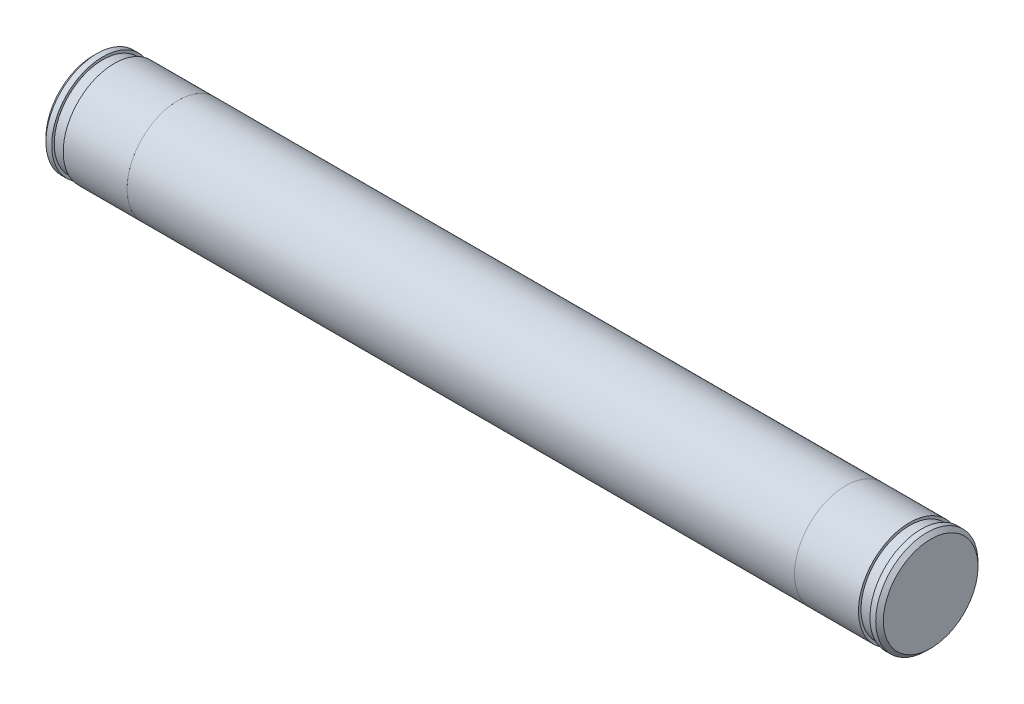
ISO-10303-21;
HEADER;
FILE_DESCRIPTION(('STEP AP214'),'2;1');
FILE_NAME('part.step','',(''),(''),'','','');
FILE_SCHEMA(('AUTOMOTIVE_DESIGN { 1 0 10303 214 1 1 1 1 }'));
ENDSEC;
DATA;
#1=APPLICATION_CONTEXT('core data for automotive mechanical design processes');
#2=APPLICATION_PROTOCOL_DEFINITION('international standard','automotive_design',2000,#1);
#3=PRODUCT_CONTEXT('',#1,'mechanical');
#4=PRODUCT('Part','Part','',(#3));
#5=PRODUCT_RELATED_PRODUCT_CATEGORY('part','',(#4));
#6=PRODUCT_DEFINITION_FORMATION('','',#4);
#7=PRODUCT_DEFINITION_CONTEXT('part definition',#1,'design');
#8=PRODUCT_DEFINITION('design','',#6,#7);
#9=PRODUCT_DEFINITION_SHAPE('','',#8);
#10=(LENGTH_UNIT() NAMED_UNIT(*) SI_UNIT(.MILLI.,.METRE.));
#11=(NAMED_UNIT(*) PLANE_ANGLE_UNIT() SI_UNIT($,.RADIAN.));
#12=(NAMED_UNIT(*) SI_UNIT($,.STERADIAN.) SOLID_ANGLE_UNIT());
#13=UNCERTAINTY_MEASURE_WITH_UNIT(LENGTH_MEASURE(1.E-05),#10,'distance_accuracy_value','');
#14=(GEOMETRIC_REPRESENTATION_CONTEXT(3) GLOBAL_UNCERTAINTY_ASSIGNED_CONTEXT((#13)) GLOBAL_UNIT_ASSIGNED_CONTEXT((#10,
#11,#12)) REPRESENTATION_CONTEXT('',''));
#15=CARTESIAN_POINT('',(0.,0.,0.));
#16=DIRECTION('',(0.,0.,1.));
#17=DIRECTION('',(1.,0.,0.));
#18=AXIS2_PLACEMENT_3D('',#15,#16,#17);
#19=CARTESIAN_POINT('',(32.75,0.,0.));
#20=DIRECTION('',(1.,0.,0.));
#21=DIRECTION('',(0.,0.,-1.));
#22=AXIS2_PLACEMENT_3D('',#19,#20,#21);
#23=PLANE('',#22);
#24=CARTESIAN_POINT('',(32.7499999999645,0.,0.));
#25=DIRECTION('',(-1.,0.,0.));
#26=DIRECTION('',(0.,0.,1.));
#27=AXIS2_PLACEMENT_3D('',#24,#25,#26);
#28=CIRCLE('',#27,3.70000000003756);
#29=CARTESIAN_POINT('',(32.7499999999645,0.,3.70000000003756));
#30=VERTEX_POINT('',#29);
#31=EDGE_CURVE('E18',#30,#30,#28,.T.);
#32=ORIENTED_EDGE('',*,*,#31,.F.);
#33=EDGE_LOOP('',(#32));
#34=FACE_BOUND('',#33,.T.);
#35=ADVANCED_FACE('F15',(#34),#23,.T.);
#36=CARTESIAN_POINT('',(-32.75,0.,0.));
#37=DIRECTION('',(-1.,0.,0.));
#38=DIRECTION('',(0.,0.,1.));
#39=AXIS2_PLACEMENT_3D('',#36,#37,#38);
#40=PLANE('',#39);
#41=CARTESIAN_POINT('',(-32.7499999999645,0.,0.));
#42=DIRECTION('',(1.,0.,0.));
#43=DIRECTION('',(0.,0.,-1.));
#44=AXIS2_PLACEMENT_3D('',#41,#42,#43);
#45=CIRCLE('',#44,3.70000000003756);
#46=CARTESIAN_POINT('',(-32.7499999999645,0.,-3.70000000003756));
#47=VERTEX_POINT('',#46);
#48=EDGE_CURVE('E62',#47,#47,#45,.T.);
#49=ORIENTED_EDGE('',*,*,#48,.F.);
#50=EDGE_LOOP('',(#49));
#51=FACE_BOUND('',#50,.T.);
#52=ADVANCED_FACE('F75',(#51),#40,.T.);
#53=CARTESIAN_POINT('',(32.449999999983,0.,0.));
#54=DIRECTION('',(-1.,0.,0.));
#55=DIRECTION('',(0.,0.,1.));
#56=AXIS2_PLACEMENT_3D('',#53,#54,#55);
#57=CONICAL_SURFACE('',#56,4.0000000000191,0.785398163397448);
#58=ORIENTED_EDGE('',*,*,#31,.T.);
#59=EDGE_LOOP('',(#58));
#60=FACE_BOUND('',#59,.T.);
#61=CARTESIAN_POINT('',(32.45,0.,0.));
#62=DIRECTION('',(1.,0.,0.));
#63=DIRECTION('',(0.,0.,-1.));
#64=AXIS2_PLACEMENT_3D('',#61,#62,#63);
#65=CIRCLE('',#64,4.);
#66=CARTESIAN_POINT('',(32.45,0.,-4.));
#67=VERTEX_POINT('',#66);
#68=EDGE_CURVE('E64',#67,#67,#65,.F.);
#69=ORIENTED_EDGE('',*,*,#68,.F.);
#70=EDGE_LOOP('',(#69));
#71=FACE_BOUND('',#70,.T.);
#72=ADVANCED_FACE('F71',(#60,#71),#57,.T.);
#73=CARTESIAN_POINT('',(-32.449999999983,0.,0.));
#74=DIRECTION('',(1.,0.,0.));
#75=DIRECTION('',(0.,0.,-1.));
#76=AXIS2_PLACEMENT_3D('',#73,#74,#75);
#77=CONICAL_SURFACE('',#76,4.0000000000191,0.785398163397448);
#78=ORIENTED_EDGE('',*,*,#48,.T.);
#79=EDGE_LOOP('',(#78));
#80=FACE_BOUND('',#79,.T.);
#81=CARTESIAN_POINT('',(-32.45,0.,0.));
#82=DIRECTION('',(1.,0.,0.));
#83=DIRECTION('',(0.,0.,-1.));
#84=AXIS2_PLACEMENT_3D('',#81,#82,#83);
#85=CIRCLE('',#84,4.);
#86=CARTESIAN_POINT('',(-32.45,0.,-4.));
#87=VERTEX_POINT('',#86);
#88=EDGE_CURVE('E61',#87,#87,#85,.T.);
#89=ORIENTED_EDGE('',*,*,#88,.F.);
#90=EDGE_LOOP('',(#89));
#91=FACE_BOUND('',#90,.T.);
#92=ADVANCED_FACE('F135',(#80,#91),#77,.T.);
#93=CARTESIAN_POINT('',(32.75,0.,0.));
#94=DIRECTION('',(1.,0.,0.));
#95=DIRECTION('',(0.,0.,-1.));
#96=AXIS2_PLACEMENT_3D('',#93,#94,#95);
#97=CYLINDRICAL_SURFACE('',#96,4.);
#98=CARTESIAN_POINT('',(32.,0.,0.));
#99=DIRECTION('',(1.,0.,0.));
#100=DIRECTION('',(0.,0.,-1.));
#101=AXIS2_PLACEMENT_3D('',#98,#99,#100);
#102=CIRCLE('',#101,4.);
#103=CARTESIAN_POINT('',(32.,0.,-4.));
#104=VERTEX_POINT('',#103);
#105=EDGE_CURVE('E59',#104,#104,#102,.F.);
#106=ORIENTED_EDGE('',*,*,#105,.F.);
#107=EDGE_LOOP('',(#106));
#108=FACE_BOUND('',#107,.T.);
#109=ORIENTED_EDGE('',*,*,#68,.T.);
#110=EDGE_LOOP('',(#109));
#111=FACE_BOUND('',#110,.T.);
#112=ADVANCED_FACE('F131',(#108,#111),#97,.T.);
#113=CARTESIAN_POINT('',(32.75,0.,0.));
#114=DIRECTION('',(1.,0.,0.));
#115=DIRECTION('',(0.,0.,-1.));
#116=AXIS2_PLACEMENT_3D('',#113,#114,#115);
#117=CYLINDRICAL_SURFACE('',#116,4.);
#118=ORIENTED_EDGE('',*,*,#88,.T.);
#119=EDGE_LOOP('',(#118));
#120=FACE_BOUND('',#119,.T.);
#121=CARTESIAN_POINT('',(-32.,0.,0.));
#122=DIRECTION('',(1.,0.,0.));
#123=DIRECTION('',(0.,0.,-1.));
#124=AXIS2_PLACEMENT_3D('',#121,#122,#123);
#125=CIRCLE('',#124,4.);
#126=CARTESIAN_POINT('',(-32.,0.,-4.));
#127=VERTEX_POINT('',#126);
#128=EDGE_CURVE('E56',#127,#127,#125,.T.);
#129=ORIENTED_EDGE('',*,*,#128,.F.);
#130=EDGE_LOOP('',(#129));
#131=FACE_BOUND('',#130,.T.);
#132=ADVANCED_FACE('F127',(#120,#131),#117,.T.);
#133=CARTESIAN_POINT('',(32.,3.99999999999999,0.));
#134=DIRECTION('',(-1.,0.,0.));
#135=DIRECTION('',(0.,0.,1.));
#136=AXIS2_PLACEMENT_3D('',#133,#134,#135);
#137=PLANE('',#136);
#138=CARTESIAN_POINT('',(32.,0.,0.));
#139=DIRECTION('',(1.,0.,0.));
#140=DIRECTION('',(0.,0.,-1.));
#141=AXIS2_PLACEMENT_3D('',#138,#139,#140);
#142=CIRCLE('',#141,3.80000000000001);
#143=CARTESIAN_POINT('',(32.,0.,-3.80000000000001));
#144=VERTEX_POINT('',#143);
#145=EDGE_CURVE('E53',#144,#144,#142,.F.);
#146=ORIENTED_EDGE('',*,*,#145,.F.);
#147=EDGE_LOOP('',(#146));
#148=FACE_BOUND('',#147,.T.);
#149=ORIENTED_EDGE('',*,*,#105,.T.);
#150=EDGE_LOOP('',(#149));
#151=FACE_BOUND('',#150,.T.);
#152=ADVANCED_FACE('F123',(#148,#151),#137,.T.);
#153=CARTESIAN_POINT('',(-32.,3.99999999999999,0.));
#154=DIRECTION('',(1.,0.,0.));
#155=DIRECTION('',(0.,0.,-1.));
#156=AXIS2_PLACEMENT_3D('',#153,#154,#155);
#157=PLANE('',#156);
#158=CARTESIAN_POINT('',(-32.,0.,0.));
#159=DIRECTION('',(1.,0.,0.));
#160=DIRECTION('',(0.,0.,-1.));
#161=AXIS2_PLACEMENT_3D('',#158,#159,#160);
#162=CIRCLE('',#161,3.80000000000001);
#163=CARTESIAN_POINT('',(-32.,0.,-3.80000000000001));
#164=VERTEX_POINT('',#163);
#165=EDGE_CURVE('E50',#164,#164,#162,.T.);
#166=ORIENTED_EDGE('',*,*,#165,.F.);
#167=EDGE_LOOP('',(#166));
#168=FACE_BOUND('',#167,.T.);
#169=ORIENTED_EDGE('',*,*,#128,.T.);
#170=EDGE_LOOP('',(#169));
#171=FACE_BOUND('',#170,.T.);
#172=ADVANCED_FACE('F119',(#168,#171),#157,.T.);
#173=CARTESIAN_POINT('',(32.75,0.,0.));
#174=DIRECTION('',(1.,0.,0.));
#175=DIRECTION('',(0.,0.,-1.));
#176=AXIS2_PLACEMENT_3D('',#173,#174,#175);
#177=CYLINDRICAL_SURFACE('',#176,3.80000000000001);
#178=CARTESIAN_POINT('',(31.1,0.,0.));
#179=DIRECTION('',(1.,0.,0.));
#180=DIRECTION('',(0.,0.,-1.));
#181=AXIS2_PLACEMENT_3D('',#178,#179,#180);
#182=CIRCLE('',#181,3.80000000000001);
#183=CARTESIAN_POINT('',(31.1,0.,-3.80000000000001));
#184=VERTEX_POINT('',#183);
#185=EDGE_CURVE('E47',#184,#184,#182,.F.);
#186=ORIENTED_EDGE('',*,*,#185,.F.);
#187=EDGE_LOOP('',(#186));
#188=FACE_BOUND('',#187,.T.);
#189=ORIENTED_EDGE('',*,*,#145,.T.);
#190=EDGE_LOOP('',(#189));
#191=FACE_BOUND('',#190,.T.);
#192=ADVANCED_FACE('F115',(#188,#191),#177,.T.);
#193=CARTESIAN_POINT('',(32.75,0.,0.));
#194=DIRECTION('',(1.,0.,0.));
#195=DIRECTION('',(0.,0.,-1.));
#196=AXIS2_PLACEMENT_3D('',#193,#194,#195);
#197=CYLINDRICAL_SURFACE('',#196,3.80000000000001);
#198=ORIENTED_EDGE('',*,*,#165,.T.);
#199=EDGE_LOOP('',(#198));
#200=FACE_BOUND('',#199,.T.);
#201=CARTESIAN_POINT('',(-31.1,0.,0.));
#202=DIRECTION('',(1.,0.,0.));
#203=DIRECTION('',(0.,0.,-1.));
#204=AXIS2_PLACEMENT_3D('',#201,#202,#203);
#205=CIRCLE('',#204,3.80000000000001);
#206=CARTESIAN_POINT('',(-31.1,0.,-3.80000000000001));
#207=VERTEX_POINT('',#206);
#208=EDGE_CURVE('E44',#207,#207,#205,.T.);
#209=ORIENTED_EDGE('',*,*,#208,.F.);
#210=EDGE_LOOP('',(#209));
#211=FACE_BOUND('',#210,.T.);
#212=ADVANCED_FACE('F111',(#200,#211),#197,.T.);
#213=CARTESIAN_POINT('',(31.1,3.8,0.));
#214=DIRECTION('',(1.,0.,0.));
#215=DIRECTION('',(0.,0.,-1.));
#216=AXIS2_PLACEMENT_3D('',#213,#214,#215);
#217=PLANE('',#216);
#218=ORIENTED_EDGE('',*,*,#185,.T.);
#219=EDGE_LOOP('',(#218));
#220=FACE_BOUND('',#219,.T.);
#221=CARTESIAN_POINT('',(31.1,0.,0.));
#222=DIRECTION('',(1.,0.,0.));
#223=DIRECTION('',(0.,0.,-1.));
#224=AXIS2_PLACEMENT_3D('',#221,#222,#223);
#225=CIRCLE('',#224,4.);
#226=CARTESIAN_POINT('',(31.1,0.,-4.));
#227=VERTEX_POINT('',#226);
#228=EDGE_CURVE('E41',#227,#227,#225,.F.);
#229=ORIENTED_EDGE('',*,*,#228,.F.);
#230=EDGE_LOOP('',(#229));
#231=FACE_BOUND('',#230,.T.);
#232=ADVANCED_FACE('F107',(#220,#231),#217,.T.);
#233=CARTESIAN_POINT('',(-31.1,3.8,0.));
#234=DIRECTION('',(-1.,0.,0.));
#235=DIRECTION('',(0.,0.,1.));
#236=AXIS2_PLACEMENT_3D('',#233,#234,#235);
#237=PLANE('',#236);
#238=ORIENTED_EDGE('',*,*,#208,.T.);
#239=EDGE_LOOP('',(#238));
#240=FACE_BOUND('',#239,.T.);
#241=CARTESIAN_POINT('',(-31.1,0.,0.));
#242=DIRECTION('',(1.,0.,0.));
#243=DIRECTION('',(0.,0.,-1.));
#244=AXIS2_PLACEMENT_3D('',#241,#242,#243);
#245=CIRCLE('',#244,4.);
#246=CARTESIAN_POINT('',(-31.1,0.,-4.));
#247=VERTEX_POINT('',#246);
#248=EDGE_CURVE('E38',#247,#247,#245,.T.);
#249=ORIENTED_EDGE('',*,*,#248,.F.);
#250=EDGE_LOOP('',(#249));
#251=FACE_BOUND('',#250,.T.);
#252=ADVANCED_FACE('F103',(#240,#251),#237,.T.);
#253=CARTESIAN_POINT('',(32.75,0.,0.));
#254=DIRECTION('',(1.,0.,0.));
#255=DIRECTION('',(0.,0.,-1.));
#256=AXIS2_PLACEMENT_3D('',#253,#254,#255);
#257=CYLINDRICAL_SURFACE('',#256,4.);
#258=CARTESIAN_POINT('',(26.1,0.,0.));
#259=DIRECTION('',(1.,0.,0.));
#260=DIRECTION('',(0.,0.,-1.));
#261=AXIS2_PLACEMENT_3D('',#258,#259,#260);
#262=CIRCLE('',#261,4.);
#263=CARTESIAN_POINT('',(26.1,0.,-4.));
#264=VERTEX_POINT('',#263);
#265=EDGE_CURVE('E35',#264,#264,#262,.F.);
#266=ORIENTED_EDGE('',*,*,#265,.F.);
#267=EDGE_LOOP('',(#266));
#268=FACE_BOUND('',#267,.T.);
#269=ORIENTED_EDGE('',*,*,#228,.T.);
#270=EDGE_LOOP('',(#269));
#271=FACE_BOUND('',#270,.T.);
#272=ADVANCED_FACE('F99',(#268,#271),#257,.T.);
#273=CARTESIAN_POINT('',(32.75,0.,0.));
#274=DIRECTION('',(1.,0.,0.));
#275=DIRECTION('',(0.,0.,-1.));
#276=AXIS2_PLACEMENT_3D('',#273,#274,#275);
#277=CYLINDRICAL_SURFACE('',#276,4.);
#278=ORIENTED_EDGE('',*,*,#248,.T.);
#279=EDGE_LOOP('',(#278));
#280=FACE_BOUND('',#279,.T.);
#281=CARTESIAN_POINT('',(-26.1,0.,0.));
#282=DIRECTION('',(1.,0.,0.));
#283=DIRECTION('',(0.,0.,-1.));
#284=AXIS2_PLACEMENT_3D('',#281,#282,#283);
#285=CIRCLE('',#284,4.);
#286=CARTESIAN_POINT('',(-26.1,0.,-4.));
#287=VERTEX_POINT('',#286);
#288=EDGE_CURVE('E27',#287,#287,#285,.T.);
#289=ORIENTED_EDGE('',*,*,#288,.F.);
#290=EDGE_LOOP('',(#289));
#291=FACE_BOUND('',#290,.T.);
#292=ADVANCED_FACE('F95',(#280,#291),#277,.T.);
#293=CARTESIAN_POINT('',(26.1,3.99900000000064,0.));
#294=DIRECTION('',(-1.,0.,0.));
#295=DIRECTION('',(0.,0.,1.));
#296=AXIS2_PLACEMENT_3D('',#293,#294,#295);
#297=PLANE('',#296);
#298=CARTESIAN_POINT('',(26.1,0.,0.));
#299=DIRECTION('',(1.,0.,0.));
#300=DIRECTION('',(0.,0.,-1.));
#301=AXIS2_PLACEMENT_3D('',#298,#299,#300);
#302=CIRCLE('',#301,3.99900000000065);
#303=CARTESIAN_POINT('',(26.1,0.,-3.99900000000065));
#304=VERTEX_POINT('',#303);
#305=EDGE_CURVE('E22',#304,#304,#302,.F.);
#306=ORIENTED_EDGE('',*,*,#305,.F.);
#307=EDGE_LOOP('',(#306));
#308=FACE_BOUND('',#307,.T.);
#309=ORIENTED_EDGE('',*,*,#265,.T.);
#310=EDGE_LOOP('',(#309));
#311=FACE_BOUND('',#310,.T.);
#312=ADVANCED_FACE('F88',(#308,#311),#297,.T.);
#313=CARTESIAN_POINT('',(-26.1,3.99999999999999,0.));
#314=DIRECTION('',(1.,0.,0.));
#315=DIRECTION('',(0.,0.,-1.));
#316=AXIS2_PLACEMENT_3D('',#313,#314,#315);
#317=PLANE('',#316);
#318=CARTESIAN_POINT('',(-26.1,0.,0.));
#319=DIRECTION('',(1.,0.,0.));
#320=DIRECTION('',(0.,0.,-1.));
#321=AXIS2_PLACEMENT_3D('',#318,#319,#320);
#322=CIRCLE('',#321,3.99900000000065);
#323=CARTESIAN_POINT('',(-26.1,0.,-3.99900000000065));
#324=VERTEX_POINT('',#323);
#325=EDGE_CURVE('E10',#324,#324,#322,.T.);
#326=ORIENTED_EDGE('',*,*,#325,.F.);
#327=EDGE_LOOP('',(#326));
#328=FACE_BOUND('',#327,.T.);
#329=ORIENTED_EDGE('',*,*,#288,.T.);
#330=EDGE_LOOP('',(#329));
#331=FACE_BOUND('',#330,.T.);
#332=ADVANCED_FACE('F83',(#328,#331),#317,.T.);
#333=CARTESIAN_POINT('',(32.75,0.,0.));
#334=DIRECTION('',(1.,0.,0.));
#335=DIRECTION('',(0.,0.,-1.));
#336=AXIS2_PLACEMENT_3D('',#333,#334,#335);
#337=CYLINDRICAL_SURFACE('',#336,3.99900000000065);
#338=ORIENTED_EDGE('',*,*,#325,.T.);
#339=EDGE_LOOP('',(#338));
#340=FACE_BOUND('',#339,.T.);
#341=ORIENTED_EDGE('',*,*,#305,.T.);
#342=EDGE_LOOP('',(#341));
#343=FACE_BOUND('',#342,.T.);
#344=ADVANCED_FACE('F81',(#340,#343),#337,.T.);
#345=CLOSED_SHELL('',(#35,#52,#72,#92,#112,#132,#152,#172,#192,#212,#232,#252,#272,#292,#312,
#332,#344));
#346=MANIFOLD_SOLID_BREP('B1',#345);
#347=ADVANCED_BREP_SHAPE_REPRESENTATION('',(#18,#346),#14);
#348=SHAPE_DEFINITION_REPRESENTATION(#9,#347);
ENDSEC;
END-ISO-10303-21;
